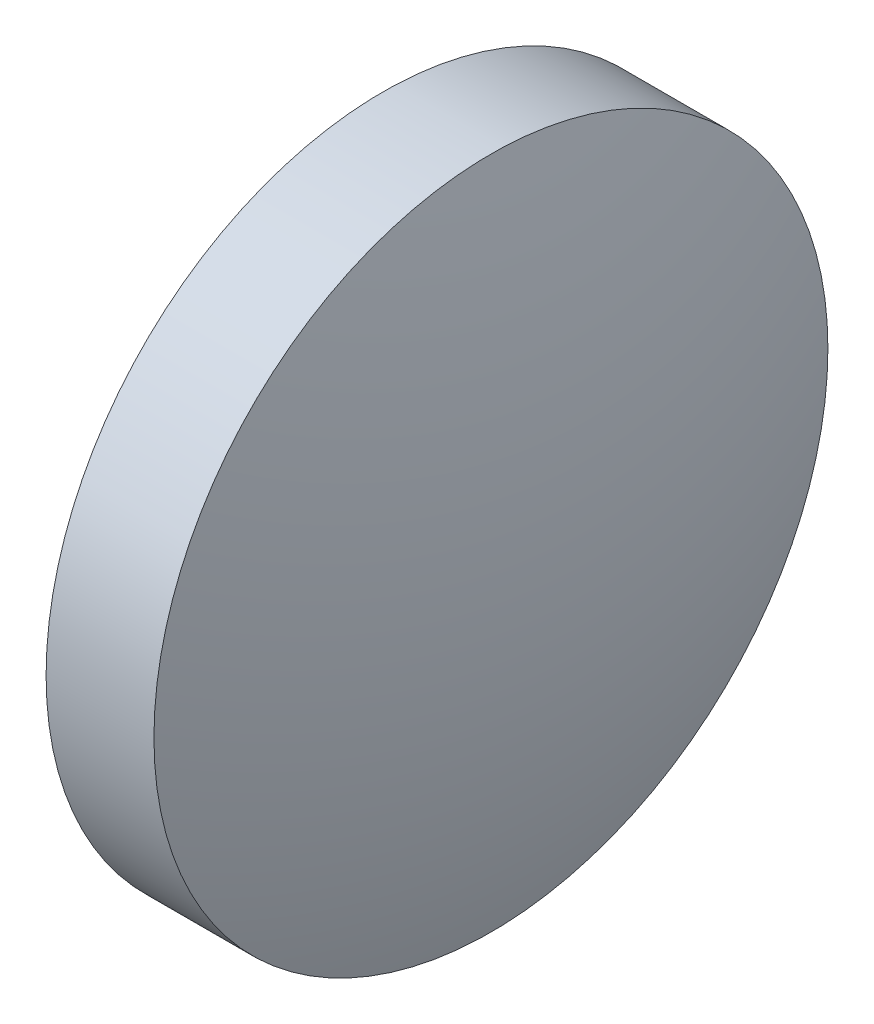
ISO-10303-21;
HEADER;
FILE_DESCRIPTION(('STEP AP214'),'2;1');
FILE_NAME('part.step','',(''),(''),'','','');
FILE_SCHEMA(('AUTOMOTIVE_DESIGN { 1 0 10303 214 1 1 1 1 }'));
ENDSEC;
DATA;
#1=APPLICATION_CONTEXT('core data for automotive mechanical design processes');
#2=APPLICATION_PROTOCOL_DEFINITION('international standard','automotive_design',2000,#1);
#3=PRODUCT_CONTEXT('',#1,'mechanical');
#4=PRODUCT('Part','Part','',(#3));
#5=PRODUCT_RELATED_PRODUCT_CATEGORY('part','',(#4));
#6=PRODUCT_DEFINITION_FORMATION('','',#4);
#7=PRODUCT_DEFINITION_CONTEXT('part definition',#1,'design');
#8=PRODUCT_DEFINITION('design','',#6,#7);
#9=PRODUCT_DEFINITION_SHAPE('','',#8);
#10=(LENGTH_UNIT() NAMED_UNIT(*) SI_UNIT(.MILLI.,.METRE.));
#11=(NAMED_UNIT(*) PLANE_ANGLE_UNIT() SI_UNIT($,.RADIAN.));
#12=(NAMED_UNIT(*) SI_UNIT($,.STERADIAN.) SOLID_ANGLE_UNIT());
#13=UNCERTAINTY_MEASURE_WITH_UNIT(LENGTH_MEASURE(1.E-05),#10,'distance_accuracy_value','');
#14=(GEOMETRIC_REPRESENTATION_CONTEXT(3) GLOBAL_UNCERTAINTY_ASSIGNED_CONTEXT((#13)) GLOBAL_UNIT_ASSIGNED_CONTEXT((#10,
#11,#12)) REPRESENTATION_CONTEXT('',''));
#15=CARTESIAN_POINT('',(0.,0.,0.));
#16=DIRECTION('',(0.,0.,1.));
#17=DIRECTION('',(1.,0.,0.));
#18=AXIS2_PLACEMENT_3D('',#15,#16,#17);
#19=CARTESIAN_POINT('',(35.9967103839267,0.,0.));
#20=DIRECTION('',(1.,0.,0.));
#21=DIRECTION('',(0.,0.,1.));
#22=AXIS2_PLACEMENT_3D('',#19,#20,#21);
#23=SPHERICAL_SURFACE('',#22,40.);
#24=CARTESIAN_POINT('',(-2.,0.,0.));
#25=DIRECTION('',(1.,0.,0.));
#26=DIRECTION('',(0.,0.,-1.));
#27=AXIS2_PLACEMENT_3D('',#24,#25,#26);
#28=CIRCLE('',#27,12.5);
#29=CARTESIAN_POINT('',(-2.,0.,-12.5));
#30=VERTEX_POINT('',#29);
#31=EDGE_CURVE('E34',#30,#30,#28,.T.);
#32=ORIENTED_EDGE('',*,*,#31,.F.);
#33=EDGE_LOOP('',(#32));
#34=FACE_BOUND('',#33,.T.);
#35=ADVANCED_FACE('F28',(#34),#23,.T.);
#36=CARTESIAN_POINT('',(-35.9967103839267,0.,0.));
#37=DIRECTION('',(1.,0.,0.));
#38=DIRECTION('',(0.,0.,1.));
#39=AXIS2_PLACEMENT_3D('',#36,#37,#38);
#40=SPHERICAL_SURFACE('',#39,40.);
#41=CARTESIAN_POINT('',(2.,0.,0.));
#42=DIRECTION('',(1.,0.,0.));
#43=DIRECTION('',(0.,0.,-1.));
#44=AXIS2_PLACEMENT_3D('',#41,#42,#43);
#45=CIRCLE('',#44,12.5);
#46=CARTESIAN_POINT('',(2.,0.,-12.5));
#47=VERTEX_POINT('',#46);
#48=EDGE_CURVE('E10',#47,#47,#45,.T.);
#49=ORIENTED_EDGE('',*,*,#48,.T.);
#50=EDGE_LOOP('',(#49));
#51=FACE_BOUND('',#50,.T.);
#52=ADVANCED_FACE('F43',(#51),#40,.T.);
#53=CARTESIAN_POINT('',(0.,0.,0.));
#54=DIRECTION('',(1.,0.,0.));
#55=DIRECTION('',(0.,0.,-1.));
#56=AXIS2_PLACEMENT_3D('',#53,#54,#55);
#57=CYLINDRICAL_SURFACE('',#56,12.5);
#58=ORIENTED_EDGE('',*,*,#48,.F.);
#59=EDGE_LOOP('',(#58));
#60=FACE_BOUND('',#59,.T.);
#61=ORIENTED_EDGE('',*,*,#31,.T.);
#62=EDGE_LOOP('',(#61));
#63=FACE_BOUND('',#62,.T.);
#64=ADVANCED_FACE('F40',(#60,#63),#57,.T.);
#65=CLOSED_SHELL('',(#35,#52,#64));
#66=MANIFOLD_SOLID_BREP('B2',#65);
#67=ADVANCED_BREP_SHAPE_REPRESENTATION('',(#18,#66),#14);
#68=SHAPE_DEFINITION_REPRESENTATION(#9,#67);
ENDSEC;
END-ISO-10303-21;
